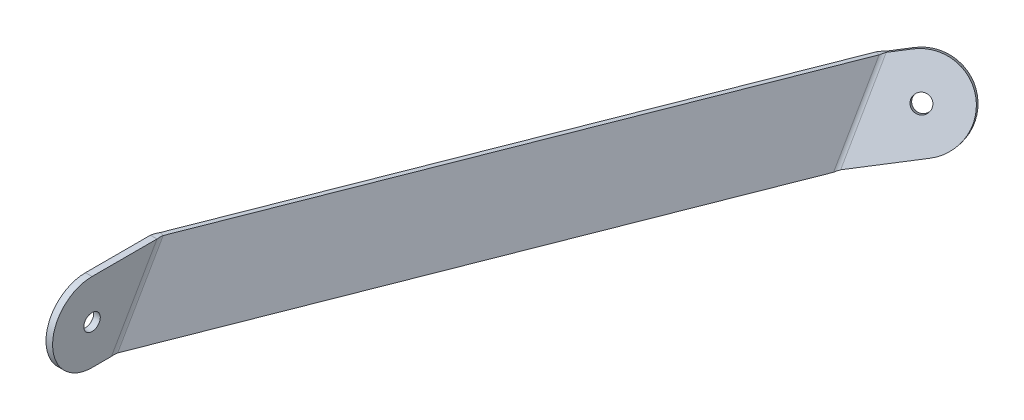
ISO-10303-21;
HEADER;
FILE_DESCRIPTION(('STEP AP214'),'2;1');
FILE_NAME('part.step','',(''),(''),'','','');
FILE_SCHEMA(('AUTOMOTIVE_DESIGN { 1 0 10303 214 1 1 1 1 }'));
ENDSEC;
DATA;
#1=APPLICATION_CONTEXT('core data for automotive mechanical design processes');
#2=APPLICATION_PROTOCOL_DEFINITION('international standard','automotive_design',2000,#1);
#3=PRODUCT_CONTEXT('',#1,'mechanical');
#4=PRODUCT('Part','Part','',(#3));
#5=PRODUCT_RELATED_PRODUCT_CATEGORY('part','',(#4));
#6=PRODUCT_DEFINITION_FORMATION('','',#4);
#7=PRODUCT_DEFINITION_CONTEXT('part definition',#1,'design');
#8=PRODUCT_DEFINITION('design','',#6,#7);
#9=PRODUCT_DEFINITION_SHAPE('','',#8);
#10=(LENGTH_UNIT() NAMED_UNIT(*) SI_UNIT(.MILLI.,.METRE.));
#11=(NAMED_UNIT(*) PLANE_ANGLE_UNIT() SI_UNIT($,.RADIAN.));
#12=(NAMED_UNIT(*) SI_UNIT($,.STERADIAN.) SOLID_ANGLE_UNIT());
#13=UNCERTAINTY_MEASURE_WITH_UNIT(LENGTH_MEASURE(1.E-05),#10,'distance_accuracy_value','');
#14=(GEOMETRIC_REPRESENTATION_CONTEXT(3) GLOBAL_UNCERTAINTY_ASSIGNED_CONTEXT((#13)) GLOBAL_UNIT_ASSIGNED_CONTEXT((#10,
#11,#12)) REPRESENTATION_CONTEXT('',''));
#15=CARTESIAN_POINT('',(0.,0.,0.));
#16=DIRECTION('',(0.,0.,1.));
#17=DIRECTION('',(1.,0.,0.));
#18=AXIS2_PLACEMENT_3D('',#15,#16,#17);
#19=CARTESIAN_POINT('',(-12.4707185432573,-1.70395305185188,-2.95133325951954));
#20=DIRECTION('',(0.866025403784438,0.249999999999999,0.433012701892221));
#21=DIRECTION('',(0.433012701892221,0.0580127018922194,-0.899519052838328));
#22=AXIS2_PLACEMENT_3D('',#19,#20,#21);
#23=PLANE('',#22);
#24=DIRECTION('',(0.433012701892221,0.0580127018922194,-0.899519052838328));
#25=VECTOR('',#24,1.);
#26=CARTESIAN_POINT('',(-17.2332185432573,16.7079929336715,-4.0564752305663));
#27=LINE('',#26,#25);
#28=CARTESIAN_POINT('',(-2.2391874454343,18.7168121956459,-35.2043297678663));
#29=VERTEX_POINT('',#28);
#30=CARTESIAN_POINT('',(110.049918479633,33.7606998213632,-268.468134188366));
#31=VERTEX_POINT('',#30);
#32=EDGE_CURVE('E525',#29,#31,#27,.T.);
#33=ORIENTED_EDGE('',*,*,#32,.T.);
#34=DIRECTION('',(0.,-0.86602540378444,0.499999999999997));
#35=VECTOR('',#34,1.);
#36=CARTESIAN_POINT('',(110.049918479633,-107.809937201526,-186.732288793855));
#37=LINE('',#36,#35);
#38=CARTESIAN_POINT('',(110.049918479633,-4.33930017863679,-246.471088932242));
#39=VERTEX_POINT('',#38);
#40=EDGE_CURVE('E548',#31,#39,#37,.T.);
#41=ORIENTED_EDGE('',*,*,#40,.T.);
#42=DIRECTION('',(0.433012701892221,0.0580127018922194,-0.899519052838328));
#43=VECTOR('',#42,1.);
#44=CARTESIAN_POINT('',(-7.70821854325729,-20.1158990373753,-1.84619128847274));
#45=LINE('',#44,#43);
#46=CARTESIAN_POINT('',(-2.2391874454343,-19.3831878043541,-13.2072845117417));
#47=VERTEX_POINT('',#46);
#48=EDGE_CURVE('E521',#47,#39,#45,.T.);
#49=ORIENTED_EDGE('',*,*,#48,.F.);
#50=DIRECTION('',(0.,-0.86602540378444,0.499999999999998));
#51=VECTOR('',#50,1.);
#52=CARTESIAN_POINT('',(-2.2391874454343,-10.564718902177,-18.298629906254));
#53=LINE('',#52,#51);
#54=EDGE_CURVE('E524',#29,#47,#53,.T.);
#55=ORIENTED_EDGE('',*,*,#54,.F.);
#56=EDGE_LOOP('',(#33,#41,#49,#55));
#57=FACE_BOUND('',#56,.T.);
#58=ADVANCED_FACE('F70',(#57),#23,.F.);
#59=CARTESIAN_POINT('',(-7.70821854325729,-20.1158990373753,-1.84619128847274));
#60=DIRECTION('',(0.249999999999999,-0.96650635094611,0.0580127018922194));
#61=DIRECTION('',(0.433012701892221,0.0580127018922194,-0.899519052838328));
#62=AXIS2_PLACEMENT_3D('',#59,#60,#61);
#63=PLANE('',#62);
#64=CARTESIAN_POINT('',(112.799549136649,-3.54555017863678,-245.096273603734));
#65=CARTESIAN_POINT('',(110.049918479633,-4.33930017863679,-246.471088932242));
#66=B_SPLINE_CURVE_WITH_KNOTS('',1,(#64,#65),.UNSPECIFIED.,.F.,.F.,(2,2),(0.,1.),.UNSPECIFIED.);
#67=CARTESIAN_POINT('',(112.799549136649,-3.54555017863683,-245.096273603734));
#68=VERTEX_POINT('',#67);
#69=EDGE_CURVE('E12',#68,#39,#66,.T.);
#70=ORIENTED_EDGE('',*,*,#69,.F.);
#71=DIRECTION('',(0.433012701892221,0.0580127018922194,-0.899519052838328));
#72=VECTOR('',#71,1.);
#73=CARTESIAN_POINT('',(-4.95858788624169,-19.3221490373753,-0.471375959964959));
#74=LINE('',#73,#72);
#75=CARTESIAN_POINT('',(0.51044321158129,-18.5894378043541,-11.8324691832339));
#76=VERTEX_POINT('',#75);
#77=EDGE_CURVE('E89',#76,#68,#74,.T.);
#78=ORIENTED_EDGE('',*,*,#77,.F.);
#79=CARTESIAN_POINT('',(-2.2391874454343,-19.3831878043541,-13.2072845117417));
#80=CARTESIAN_POINT('',(0.510443211581292,-18.5894378043541,-11.8324691832339));
#81=B_SPLINE_CURVE_WITH_KNOTS('',1,(#79,#80),.UNSPECIFIED.,.F.,.F.,(2,2),(0.,1.),.UNSPECIFIED.);
#82=EDGE_CURVE('E542',#76,#47,#81,.F.);
#83=ORIENTED_EDGE('',*,*,#82,.T.);
#84=ORIENTED_EDGE('',*,*,#48,.T.);
#85=EDGE_LOOP('',(#70,#78,#83,#84));
#86=FACE_BOUND('',#85,.T.);
#87=ADVANCED_FACE('F72',(#86),#63,.T.);
#88=CARTESIAN_POINT('',(-17.2332185432573,16.7079929336715,-4.0564752305663));
#89=DIRECTION('',(0.249999999999999,-0.96650635094611,0.0580127018922194));
#90=DIRECTION('',(0.433012701892221,0.0580127018922194,-0.899519052838328));
#91=AXIS2_PLACEMENT_3D('',#88,#89,#90);
#92=PLANE('',#91);
#93=CARTESIAN_POINT('',(110.049918479633,33.7606998213632,-268.468134188366));
#94=CARTESIAN_POINT('',(112.799549136649,34.5544498213632,-267.093318859859));
#95=B_SPLINE_CURVE_WITH_KNOTS('',1,(#93,#94),.UNSPECIFIED.,.F.,.F.,(2,2),(0.,1.),.UNSPECIFIED.);
#96=CARTESIAN_POINT('',(112.799549136649,34.5544498213632,-267.093318859859));
#97=VERTEX_POINT('',#96);
#98=EDGE_CURVE('E305',#31,#97,#95,.T.);
#99=ORIENTED_EDGE('',*,*,#98,.F.);
#100=ORIENTED_EDGE('',*,*,#32,.F.);
#101=CARTESIAN_POINT('',(0.510443211581286,19.5105621956459,-33.8295144393585));
#102=CARTESIAN_POINT('',(-2.23918744543431,18.7168121956459,-35.2043297678663));
#103=B_SPLINE_CURVE_WITH_KNOTS('',1,(#101,#102),.UNSPECIFIED.,.F.,.F.,(2,2),(0.,1.),.UNSPECIFIED.);
#104=CARTESIAN_POINT('',(0.510443211581286,19.5105621956459,-33.8295144393585));
#105=VERTEX_POINT('',#104);
#106=EDGE_CURVE('E669',#29,#105,#103,.F.);
#107=ORIENTED_EDGE('',*,*,#106,.T.);
#108=DIRECTION('',(0.433012701892221,0.0580127018922194,-0.899519052838328));
#109=VECTOR('',#108,1.);
#110=CARTESIAN_POINT('',(-14.4835878862417,17.5017429336715,-2.68165990205852));
#111=LINE('',#110,#109);
#112=EDGE_CURVE('E97',#105,#97,#111,.T.);
#113=ORIENTED_EDGE('',*,*,#112,.T.);
#114=EDGE_LOOP('',(#99,#100,#107,#113));
#115=FACE_BOUND('',#114,.T.);
#116=ADVANCED_FACE('F607',(#115),#92,.F.);
#117=CARTESIAN_POINT('',(-9.72108788624168,-0.910203051851881,-1.57651793101174));
#118=DIRECTION('',(0.866025403784438,0.249999999999999,0.433012701892221));
#119=DIRECTION('',(0.433012701892221,0.0580127018922194,-0.899519052838328));
#120=AXIS2_PLACEMENT_3D('',#117,#118,#119);
#121=PLANE('',#120);
#122=DIRECTION('',(0.,-0.86602540378444,0.499999999999997));
#123=VECTOR('',#122,1.);
#124=CARTESIAN_POINT('',(112.799549136649,-107.016187201526,-185.357473465347));
#125=LINE('',#124,#123);
#126=EDGE_CURVE('E82',#97,#68,#125,.T.);
#127=ORIENTED_EDGE('',*,*,#126,.F.);
#128=ORIENTED_EDGE('',*,*,#112,.F.);
#129=DIRECTION('',(0.,-0.86602540378444,0.499999999999998));
#130=VECTOR('',#129,1.);
#131=CARTESIAN_POINT('',(0.51044321158129,-9.77096890217699,-16.9238145777462));
#132=LINE('',#131,#130);
#133=EDGE_CURVE('E545',#105,#76,#132,.T.);
#134=ORIENTED_EDGE('',*,*,#133,.T.);
#135=ORIENTED_EDGE('',*,*,#77,.T.);
#136=EDGE_LOOP('',(#127,#128,#134,#135));
#137=FACE_BOUND('',#136,.T.);
#138=ADVANCED_FACE('F611',(#137),#121,.T.);
#139=CARTESIAN_POINT('',(-3.175,0.,0.));
#140=DIRECTION('',(1.,0.,0.));
#141=DIRECTION('',(0.,0.,-1.));
#142=AXIS2_PLACEMENT_3D('',#139,#140,#141);
#143=CYLINDRICAL_SURFACE('',#142,19.05);
#144=DIRECTION('',(-1.,0.,0.));
#145=VECTOR('',#144,1.);
#146=CARTESIAN_POINT('',(-3.175,-19.05,0.));
#147=LINE('',#146,#145);
#148=CARTESIAN_POINT('',(0.,-19.05,0.));
#149=VERTEX_POINT('',#148);
#150=CARTESIAN_POINT('',(-3.175,-19.05,0.));
#151=VERTEX_POINT('',#150);
#152=EDGE_CURVE('E459',#149,#151,#147,.T.);
#153=ORIENTED_EDGE('',*,*,#152,.F.);
#154=CARTESIAN_POINT('',(0.,0.,0.));
#155=DIRECTION('',(1.,0.,0.));
#156=DIRECTION('',(0.,0.,-1.));
#157=AXIS2_PLACEMENT_3D('',#154,#155,#156);
#158=CIRCLE('',#157,19.05);
#159=CARTESIAN_POINT('',(0.,19.05,0.));
#160=VERTEX_POINT('',#159);
#161=EDGE_CURVE('E455',#160,#149,#158,.T.);
#162=ORIENTED_EDGE('',*,*,#161,.F.);
#163=DIRECTION('',(-1.,0.,0.));
#164=VECTOR('',#163,1.);
#165=CARTESIAN_POINT('',(-3.175,19.05,0.));
#166=LINE('',#165,#164);
#167=CARTESIAN_POINT('',(-3.175,19.05,0.));
#168=VERTEX_POINT('',#167);
#169=EDGE_CURVE('E469',#160,#168,#166,.T.);
#170=ORIENTED_EDGE('',*,*,#169,.T.);
#171=CARTESIAN_POINT('',(-3.175,0.,0.));
#172=DIRECTION('',(1.,0.,0.));
#173=DIRECTION('',(0.,0.,-1.));
#174=AXIS2_PLACEMENT_3D('',#171,#172,#173);
#175=CIRCLE('',#174,19.05);
#176=EDGE_CURVE('E466',#168,#151,#175,.T.);
#177=ORIENTED_EDGE('',*,*,#176,.T.);
#178=EDGE_LOOP('',(#153,#162,#170,#177));
#179=FACE_BOUND('',#178,.T.);
#180=ADVANCED_FACE('F402',(#179),#143,.T.);
#181=CARTESIAN_POINT('',(-3.175,0.,0.));
#182=DIRECTION('',(1.,0.,0.));
#183=DIRECTION('',(0.,0.,-1.));
#184=AXIS2_PLACEMENT_3D('',#181,#182,#183);
#185=CYLINDRICAL_SURFACE('',#184,3.96874999999999);
#186=CARTESIAN_POINT('',(-3.175,0.,0.));
#187=DIRECTION('',(-1.,0.,0.));
#188=DIRECTION('',(0.,0.,1.));
#189=AXIS2_PLACEMENT_3D('',#186,#187,#188);
#190=CIRCLE('',#189,3.96874999999999);
#191=CARTESIAN_POINT('',(-3.175,0.,3.96874999999999));
#192=VERTEX_POINT('',#191);
#193=EDGE_CURVE('E462',#192,#192,#190,.T.);
#194=ORIENTED_EDGE('',*,*,#193,.T.);
#195=EDGE_LOOP('',(#194));
#196=FACE_BOUND('',#195,.T.);
#197=CARTESIAN_POINT('',(0.,0.,0.));
#198=DIRECTION('',(-1.,0.,0.));
#199=DIRECTION('',(0.,0.,1.));
#200=AXIS2_PLACEMENT_3D('',#197,#198,#199);
#201=CIRCLE('',#200,3.96874999999999);
#202=CARTESIAN_POINT('',(0.,0.,3.96874999999999));
#203=VERTEX_POINT('',#202);
#204=EDGE_CURVE('E445',#203,#203,#201,.T.);
#205=ORIENTED_EDGE('',*,*,#204,.F.);
#206=EDGE_LOOP('',(#205));
#207=FACE_BOUND('',#206,.T.);
#208=ADVANCED_FACE('F690',(#196,#207),#185,.F.);
#209=CARTESIAN_POINT('',(-3.175,0.,0.));
#210=DIRECTION('',(1.,0.,0.));
#211=DIRECTION('',(0.,0.,-1.));
#212=AXIS2_PLACEMENT_3D('',#209,#210,#211);
#213=PLANE('',#212);
#214=ORIENTED_EDGE('',*,*,#193,.F.);
#215=EDGE_LOOP('',(#214));
#216=FACE_BOUND('',#215,.T.);
#217=DIRECTION('',(0.,0.,-1.));
#218=VECTOR('',#217,1.);
#219=CARTESIAN_POINT('',(-3.175,19.05,0.));
#220=LINE('',#219,#218);
#221=CARTESIAN_POINT('',(-3.175,19.05,-31.3639042061113));
#222=VERTEX_POINT('',#221);
#223=EDGE_CURVE('E465',#168,#222,#220,.T.);
#224=ORIENTED_EDGE('',*,*,#223,.T.);
#225=DIRECTION('',(0.,-0.86602540378444,0.499999999999998));
#226=VECTOR('',#225,1.);
#227=CARTESIAN_POINT('',(-3.175,-8.81846890217699,-15.2740361835368));
#228=LINE('',#227,#226);
#229=CARTESIAN_POINT('',(-3.175,-19.05,-9.36685894998671));
#230=VERTEX_POINT('',#229);
#231=EDGE_CURVE('E461',#222,#230,#228,.T.);
#232=ORIENTED_EDGE('',*,*,#231,.T.);
#233=DIRECTION('',(0.,0.,-1.));
#234=VECTOR('',#233,1.);
#235=CARTESIAN_POINT('',(-3.175,-19.05,0.));
#236=LINE('',#235,#234);
#237=EDGE_CURVE('E458',#151,#230,#236,.T.);
#238=ORIENTED_EDGE('',*,*,#237,.F.);
#239=ORIENTED_EDGE('',*,*,#176,.F.);
#240=EDGE_LOOP('',(#224,#232,#238,#239));
#241=FACE_BOUND('',#240,.T.);
#242=ADVANCED_FACE('F498',(#216,#241),#213,.F.);
#243=CARTESIAN_POINT('',(-3.175,-19.05,0.));
#244=DIRECTION('',(0.,-1.,0.));
#245=DIRECTION('',(0.,0.,-1.));
#246=AXIS2_PLACEMENT_3D('',#243,#244,#245);
#247=PLANE('',#246);
#248=CARTESIAN_POINT('',(0.,-19.05,-9.36685894998671));
#249=CARTESIAN_POINT('',(-3.175,-19.05,-9.36685894998671));
#250=B_SPLINE_CURVE_WITH_KNOTS('',1,(#248,#249),.UNSPECIFIED.,.F.,.F.,(2,2),(0.,1.),.UNSPECIFIED.);
#251=CARTESIAN_POINT('',(0.,-19.05,-9.36685894998669));
#252=VERTEX_POINT('',#251);
#253=EDGE_CURVE('E441',#252,#230,#250,.T.);
#254=ORIENTED_EDGE('',*,*,#253,.F.);
#255=DIRECTION('',(0.,0.,-1.));
#256=VECTOR('',#255,1.);
#257=CARTESIAN_POINT('',(0.,-19.05,0.));
#258=LINE('',#257,#256);
#259=EDGE_CURVE('E454',#149,#252,#258,.T.);
#260=ORIENTED_EDGE('',*,*,#259,.F.);
#261=ORIENTED_EDGE('',*,*,#152,.T.);
#262=ORIENTED_EDGE('',*,*,#237,.T.);
#263=EDGE_LOOP('',(#254,#260,#261,#262));
#264=FACE_BOUND('',#263,.T.);
#265=ADVANCED_FACE('F487',(#264),#247,.T.);
#266=CARTESIAN_POINT('',(0.,0.,0.));
#267=DIRECTION('',(1.,0.,0.));
#268=DIRECTION('',(0.,0.,-1.));
#269=AXIS2_PLACEMENT_3D('',#266,#267,#268);
#270=PLANE('',#269);
#271=DIRECTION('',(0.,-0.86602540378444,0.499999999999998));
#272=VECTOR('',#271,1.);
#273=CARTESIAN_POINT('',(0.,-8.81846890217699,-15.2740361835368));
#274=LINE('',#273,#272);
#275=CARTESIAN_POINT('',(0.,19.05,-31.3639042061113));
#276=VERTEX_POINT('',#275);
#277=EDGE_CURVE('E485',#276,#252,#274,.T.);
#278=ORIENTED_EDGE('',*,*,#277,.F.);
#279=DIRECTION('',(0.,0.,-1.));
#280=VECTOR('',#279,1.);
#281=CARTESIAN_POINT('',(0.,19.05,0.));
#282=LINE('',#281,#280);
#283=EDGE_CURVE('E453',#160,#276,#282,.T.);
#284=ORIENTED_EDGE('',*,*,#283,.F.);
#285=ORIENTED_EDGE('',*,*,#161,.T.);
#286=ORIENTED_EDGE('',*,*,#259,.T.);
#287=EDGE_LOOP('',(#278,#284,#285,#286));
#288=FACE_BOUND('',#287,.T.);
#289=ORIENTED_EDGE('',*,*,#204,.T.);
#290=EDGE_LOOP('',(#289));
#291=FACE_BOUND('',#290,.T.);
#292=ADVANCED_FACE('F497',(#288,#291),#270,.T.);
#293=CARTESIAN_POINT('',(-3.175,19.05,0.));
#294=DIRECTION('',(0.,-1.,0.));
#295=DIRECTION('',(0.,0.,-1.));
#296=AXIS2_PLACEMENT_3D('',#293,#294,#295);
#297=PLANE('',#296);
#298=CARTESIAN_POINT('',(-3.175,19.05,-31.3639042061113));
#299=CARTESIAN_POINT('',(0.,19.05,-31.3639042061113));
#300=B_SPLINE_CURVE_WITH_KNOTS('',1,(#298,#299),.UNSPECIFIED.,.F.,.F.,(2,2),(0.,1.),.UNSPECIFIED.);
#301=EDGE_CURVE('E428',#222,#276,#300,.T.);
#302=ORIENTED_EDGE('',*,*,#301,.F.);
#303=ORIENTED_EDGE('',*,*,#223,.F.);
#304=ORIENTED_EDGE('',*,*,#169,.F.);
#305=ORIENTED_EDGE('',*,*,#283,.T.);
#306=EDGE_LOOP('',(#302,#303,#304,#305));
#307=FACE_BOUND('',#306,.T.);
#308=ADVANCED_FACE('F401',(#307),#297,.F.);
#309=CARTESIAN_POINT('',(-3.175,19.05,-31.3639042061113));
#310=CARTESIAN_POINT('',(-3.175,18.9112680631787,-32.6935130958568));
#311=CARTESIAN_POINT('',(-2.84960796744825,18.7737632895088,-34.0163694532108));
#312=CARTESIAN_POINT('',(-2.23918744543431,18.7168121956459,-35.2043297678663));
#313=CARTESIAN_POINT('',(0.,19.05,-31.3639042061113));
#314=CARTESIAN_POINT('',(0.,19.1886874107079,-32.2126590735088));
#315=CARTESIAN_POINT('',(0.17759342588229,19.3272813692986,-33.0579976335316));
#316=CARTESIAN_POINT('',(0.510443211581286,19.5105621956459,-33.8295144393585));
#317=B_SPLINE_SURFACE_WITH_KNOTS('',1,3,((#309,#310,#311,#312),(#313,#314,#315,#316)),
.UNSPECIFIED.,.F.,.F.,.F.,(2,2),(4,4),(0.,1.),(0.,1.),.UNSPECIFIED.);
#318=CARTESIAN_POINT('',(0.,19.05,-31.3639042061113));
#319=CARTESIAN_POINT('',(0.,19.1886874107079,-32.2126590735088));
#320=CARTESIAN_POINT('',(0.17759342588229,19.3272813692986,-33.0579976335316));
#321=CARTESIAN_POINT('',(0.510443211581286,19.5105621956459,-33.8295144393585));
#322=B_SPLINE_CURVE_WITH_KNOTS('',3,(#318,#319,#320,#321),.UNSPECIFIED.,.F.,.F.,(4,4),(0.,1.),.UNSPECIFIED.);
#323=EDGE_CURVE('E554',#276,#105,#322,.T.);
#324=CARTESIAN_POINT('',(-2.23918744543431,18.7168121956459,-35.2043297678663));
#325=CARTESIAN_POINT('',(-2.84960796744825,18.7737632895088,-34.0163694532108));
#326=CARTESIAN_POINT('',(-3.175,18.9112680631787,-32.6935130958568));
#327=CARTESIAN_POINT('',(-3.175,19.05,-31.3639042061113));
#328=B_SPLINE_CURVE_WITH_KNOTS('',3,(#324,#325,#326,#327),.UNSPECIFIED.,.F.,.F.,(4,4),(0.,1.),.UNSPECIFIED.);
#329=EDGE_CURVE('E384',#222,#29,#328,.F.);
#330=ORIENTED_EDGE('',*,*,#301,.T.);
#331=ORIENTED_EDGE('',*,*,#323,.T.);
#332=ORIENTED_EDGE('',*,*,#106,.F.);
#333=ORIENTED_EDGE('',*,*,#329,.F.);
#334=EDGE_LOOP('',(#330,#331,#332,#333));
#335=FACE_BOUND('',#334,.T.);
#336=ADVANCED_FACE('F390',(#335),#317,.T.);
#337=CARTESIAN_POINT('',(-2.2391874454343,-19.3831878043541,-13.2072845117417));
#338=CARTESIAN_POINT('',(-2.84960796744823,-19.3262367104912,-12.0193241970862));
#339=CARTESIAN_POINT('',(-3.175,-19.1887319368213,-10.6964678397322));
#340=CARTESIAN_POINT('',(-3.175,-19.05,-9.36685894998671));
#341=CARTESIAN_POINT('',(0.510443211581292,-18.5894378043541,-11.8324691832339));
#342=CARTESIAN_POINT('',(0.177593425882298,-18.7727186307014,-11.060952377407));
#343=CARTESIAN_POINT('',(0.,-18.9113125892921,-10.2156138173842));
#344=CARTESIAN_POINT('',(0.,-19.05,-9.36685894998671));
#345=B_SPLINE_SURFACE_WITH_KNOTS('',1,3,((#337,#338,#339,#340),(#341,#342,#343,#344)),
.UNSPECIFIED.,.F.,.F.,.F.,(2,2),(4,4),(0.,1.),(0.,1.),.UNSPECIFIED.);
#346=CARTESIAN_POINT('',(0.510443211581292,-18.5894378043541,-11.8324691832339));
#347=CARTESIAN_POINT('',(0.177593425882298,-18.7727186307014,-11.060952377407));
#348=CARTESIAN_POINT('',(0.,-18.9113125892921,-10.2156138173842));
#349=CARTESIAN_POINT('',(0.,-19.05,-9.36685894998671));
#350=B_SPLINE_CURVE_WITH_KNOTS('',3,(#346,#347,#348,#349),.UNSPECIFIED.,.F.,.F.,(4,4),(0.,1.),.UNSPECIFIED.);
#351=EDGE_CURVE('E347',#76,#252,#350,.T.);
#352=CARTESIAN_POINT('',(-3.175,-19.05,-9.36685894998671));
#353=CARTESIAN_POINT('',(-3.175,-19.1887319368213,-10.6964678397322));
#354=CARTESIAN_POINT('',(-2.84960796744823,-19.3262367104912,-12.0193241970862));
#355=CARTESIAN_POINT('',(-2.2391874454343,-19.3831878043541,-13.2072845117417));
#356=B_SPLINE_CURVE_WITH_KNOTS('',3,(#352,#353,#354,#355),.UNSPECIFIED.,.F.,.F.,(4,4),(0.,1.),.UNSPECIFIED.);
#357=EDGE_CURVE('E340',#47,#230,#356,.F.);
#358=ORIENTED_EDGE('',*,*,#82,.F.);
#359=ORIENTED_EDGE('',*,*,#351,.T.);
#360=ORIENTED_EDGE('',*,*,#253,.T.);
#361=ORIENTED_EDGE('',*,*,#357,.F.);
#362=EDGE_LOOP('',(#358,#359,#360,#361));
#363=FACE_BOUND('',#362,.T.);
#364=ADVANCED_FACE('F360',(#363),#345,.T.);
#365=CARTESIAN_POINT('',(3.81,39.6841629259491,-43.2770437259105));
#366=DIRECTION('',(0.,-0.86602540378444,0.499999999999998));
#367=DIRECTION('',(0.,-0.499999999999998,-0.86602540378444));
#368=AXIS2_PLACEMENT_3D('',#365,#366,#367);
#369=CYLINDRICAL_SURFACE('',#368,6.985);
#370=ORIENTED_EDGE('',*,*,#357,.T.);
#371=ORIENTED_EDGE('',*,*,#231,.F.);
#372=ORIENTED_EDGE('',*,*,#329,.T.);
#373=ORIENTED_EDGE('',*,*,#54,.T.);
#374=EDGE_LOOP('',(#370,#371,#372,#373));
#375=FACE_BOUND('',#374,.T.);
#376=ADVANCED_FACE('F279',(#375),#369,.T.);
#377=CARTESIAN_POINT('',(3.81,39.6841629259491,-43.2770437259105));
#378=DIRECTION('',(0.,-0.86602540378444,0.499999999999998));
#379=DIRECTION('',(0.,-0.499999999999998,-0.86602540378444));
#380=AXIS2_PLACEMENT_3D('',#377,#378,#379);
#381=CYLINDRICAL_SURFACE('',#380,3.81);
#382=ORIENTED_EDGE('',*,*,#351,.F.);
#383=ORIENTED_EDGE('',*,*,#133,.F.);
#384=ORIENTED_EDGE('',*,*,#323,.F.);
#385=ORIENTED_EDGE('',*,*,#277,.T.);
#386=EDGE_LOOP('',(#382,#383,#384,#385));
#387=FACE_BOUND('',#386,.T.);
#388=ADVANCED_FACE('F275',(#387),#381,.F.);
#389=CARTESIAN_POINT('',(110.049918479633,33.7606998213632,-268.468134188366));
#390=CARTESIAN_POINT('',(110.660339001647,33.7037487275004,-269.656094503022));
#391=CARTESIAN_POINT('',(111.549326566957,33.7289399701064,-270.697153093997));
#392=CARTESIAN_POINT('',(112.606605925067,33.895418294292,-271.498122304687));
#393=CARTESIAN_POINT('',(112.799549136649,34.5544498213632,-267.093318859859));
#394=CARTESIAN_POINT('',(113.132398922348,34.7377306477105,-267.864835665685));
#395=CARTESIAN_POINT('',(113.617593184949,34.9651213192425,-268.556373807349));
#396=CARTESIAN_POINT('',(114.194105925067,35.2702336227998,-269.116872304687));
#397=B_SPLINE_SURFACE_WITH_KNOTS('',1,3,((#389,#390,#391,#392),(#393,#394,#395,#396)),
.UNSPECIFIED.,.F.,.F.,.F.,(2,2),(4,4),(0.,1.),(0.,1.),.UNSPECIFIED.);
#398=CARTESIAN_POINT('',(112.799549136649,34.5544498213632,-267.093318859859));
#399=CARTESIAN_POINT('',(113.132398922348,34.7377306477105,-267.864835665685));
#400=CARTESIAN_POINT('',(113.617593184949,34.9651213192425,-268.556373807349));
#401=CARTESIAN_POINT('',(114.194105925067,35.2702336227998,-269.116872304687));
#402=B_SPLINE_CURVE_WITH_KNOTS('',3,(#398,#399,#400,#401),.UNSPECIFIED.,.F.,.F.,(4,4),(0.,1.),.UNSPECIFIED.);
#403=CARTESIAN_POINT('',(114.194105925067,35.2702336227997,-269.116872304687));
#404=VERTEX_POINT('',#403);
#405=EDGE_CURVE('E174',#97,#404,#402,.T.);
#406=CARTESIAN_POINT('',(114.194105925067,35.2702336227998,-269.116872304687));
#407=CARTESIAN_POINT('',(112.606605925067,33.895418294292,-271.498122304687));
#408=B_SPLINE_CURVE_WITH_KNOTS('',1,(#406,#407),.UNSPECIFIED.,.F.,.F.,(2,2),(0.,1.),.UNSPECIFIED.);
#409=CARTESIAN_POINT('',(112.606605925067,33.8954182942919,-271.498122304687));
#410=VERTEX_POINT('',#409);
#411=EDGE_CURVE('E191',#410,#404,#408,.F.);
#412=CARTESIAN_POINT('',(112.606605925067,33.895418294292,-271.498122304687));
#413=CARTESIAN_POINT('',(111.549326566957,33.7289399701064,-270.697153093997));
#414=CARTESIAN_POINT('',(110.660339001647,33.7037487275004,-269.656094503022));
#415=CARTESIAN_POINT('',(110.049918479633,33.7606998213632,-268.468134188366));
#416=B_SPLINE_CURVE_WITH_KNOTS('',3,(#412,#413,#414,#415),.UNSPECIFIED.,.F.,.F.,(4,4),(0.,1.),.UNSPECIFIED.);
#417=EDGE_CURVE('E240',#31,#410,#416,.F.);
#418=ORIENTED_EDGE('',*,*,#98,.T.);
#419=ORIENTED_EDGE('',*,*,#405,.T.);
#420=ORIENTED_EDGE('',*,*,#411,.F.);
#421=ORIENTED_EDGE('',*,*,#417,.F.);
#422=EDGE_LOOP('',(#418,#419,#420,#421));
#423=FACE_BOUND('',#422,.T.);
#424=ADVANCED_FACE('F264',(#423),#397,.T.);
#425=CARTESIAN_POINT('',(112.606605925067,-4.20458170570804,-249.501077048563));
#426=CARTESIAN_POINT('',(111.549326566957,-4.37106002989363,-248.700107837873));
#427=CARTESIAN_POINT('',(110.660339001647,-4.39625127249963,-247.659049246897));
#428=CARTESIAN_POINT('',(110.049918479633,-4.33930017863679,-246.471088932242));
#429=CARTESIAN_POINT('',(114.194105925067,-2.82976637720024,-247.119827048563));
#430=CARTESIAN_POINT('',(113.617593184948,-3.13487868075772,-246.559328551224));
#431=CARTESIAN_POINT('',(113.132398922348,-3.36226935228937,-245.867790409561));
#432=CARTESIAN_POINT('',(112.799549136649,-3.54555017863678,-245.096273603734));
#433=B_SPLINE_SURFACE_WITH_KNOTS('',1,3,((#425,#426,#427,#428),(#429,#430,#431,#432)),
.UNSPECIFIED.,.F.,.F.,.F.,(2,2),(4,4),(0.,1.),(0.,1.),.UNSPECIFIED.);
#434=CARTESIAN_POINT('',(112.606605925067,-4.20458170570804,-249.501077048563));
#435=CARTESIAN_POINT('',(114.194105925067,-2.82976637720024,-247.119827048563));
#436=B_SPLINE_CURVE_WITH_KNOTS('',1,(#434,#435),.UNSPECIFIED.,.F.,.F.,(2,2),(0.,1.),.UNSPECIFIED.);
#437=CARTESIAN_POINT('',(114.194105925067,-2.82976637720028,-247.119827048563));
#438=VERTEX_POINT('',#437);
#439=CARTESIAN_POINT('',(112.606605925067,-4.20458170570804,-249.501077048563));
#440=VERTEX_POINT('',#439);
#441=EDGE_CURVE('E170',#438,#440,#436,.F.);
#442=CARTESIAN_POINT('',(114.194105925067,-2.82976637720024,-247.119827048563));
#443=CARTESIAN_POINT('',(113.617593184948,-3.13487868075772,-246.559328551224));
#444=CARTESIAN_POINT('',(113.132398922348,-3.36226935228937,-245.867790409561));
#445=CARTESIAN_POINT('',(112.799549136649,-3.54555017863678,-245.096273603734));
#446=B_SPLINE_CURVE_WITH_KNOTS('',3,(#442,#443,#444,#445),.UNSPECIFIED.,.F.,.F.,(4,4),(0.,1.),.UNSPECIFIED.);
#447=EDGE_CURVE('E559',#438,#68,#446,.T.);
#448=CARTESIAN_POINT('',(110.049918479633,-4.33930017863679,-246.471088932242));
#449=CARTESIAN_POINT('',(110.660339001647,-4.39625127249963,-247.659049246897));
#450=CARTESIAN_POINT('',(111.549326566957,-4.37106002989363,-248.700107837873));
#451=CARTESIAN_POINT('',(112.606605925067,-4.20458170570804,-249.501077048563));
#452=B_SPLINE_CURVE_WITH_KNOTS('',3,(#448,#449,#450,#451),.UNSPECIFIED.,.F.,.F.,(4,4),(0.,1.),.UNSPECIFIED.);
#453=EDGE_CURVE('E556',#440,#39,#452,.F.);
#454=ORIENTED_EDGE('',*,*,#441,.F.);
#455=ORIENTED_EDGE('',*,*,#447,.T.);
#456=ORIENTED_EDGE('',*,*,#69,.T.);
#457=ORIENTED_EDGE('',*,*,#453,.F.);
#458=EDGE_LOOP('',(#454,#455,#456,#457));
#459=FACE_BOUND('',#458,.T.);
#460=ADVANCED_FACE('F216',(#459),#433,.T.);
#461=CARTESIAN_POINT('',(116.099105925067,57.4162639579163,-278.092888880148));
#462=DIRECTION('',(0.,-0.86602540378444,0.499999999999997));
#463=DIRECTION('',(0.,-0.499999999999997,-0.866025403784441));
#464=AXIS2_PLACEMENT_3D('',#461,#462,#463);
#465=CYLINDRICAL_SURFACE('',#464,6.985);
#466=ORIENTED_EDGE('',*,*,#453,.T.);
#467=ORIENTED_EDGE('',*,*,#40,.F.);
#468=ORIENTED_EDGE('',*,*,#417,.T.);
#469=DIRECTION('',(0.,-0.866025403784441,0.499999999999997));
#470=VECTOR('',#469,1.);
#471=CARTESIAN_POINT('',(112.606605925068,-109.088280924243,-188.946445071138));
#472=LINE('',#471,#470);
#473=EDGE_CURVE('E199',#410,#440,#472,.T.);
#474=ORIENTED_EDGE('',*,*,#473,.T.);
#475=EDGE_LOOP('',(#466,#467,#468,#474));
#476=FACE_BOUND('',#475,.T.);
#477=ADVANCED_FACE('F206',(#476),#465,.T.);
#478=CARTESIAN_POINT('',(116.099105925067,57.4162639579163,-278.092888880148));
#479=DIRECTION('',(0.,-0.86602540378444,0.499999999999997));
#480=DIRECTION('',(0.,-0.499999999999997,-0.866025403784441));
#481=AXIS2_PLACEMENT_3D('',#478,#479,#480);
#482=CYLINDRICAL_SURFACE('',#481,3.81);
#483=ORIENTED_EDGE('',*,*,#447,.F.);
#484=DIRECTION('',(0.,-0.866025403784441,0.499999999999997));
#485=VECTOR('',#484,1.);
#486=CARTESIAN_POINT('',(114.194105925068,-107.713465595735,-186.565195071138));
#487=LINE('',#486,#485);
#488=EDGE_CURVE('E576',#404,#438,#487,.T.);
#489=ORIENTED_EDGE('',*,*,#488,.F.);
#490=ORIENTED_EDGE('',*,*,#405,.F.);
#491=ORIENTED_EDGE('',*,*,#126,.T.);
#492=EDGE_LOOP('',(#483,#489,#490,#491));
#493=FACE_BOUND('',#492,.T.);
#494=ADVANCED_FACE('F215',(#493),#482,.F.);
#495=CARTESIAN_POINT('',(127.880642108604,19.2546527453804,-273.227963162905));
#496=DIRECTION('',(0.499999999999998,0.433012701892218,0.750000000000002));
#497=DIRECTION('',(0.750000000000002,0.21650635094611,-0.624999999999997));
#498=AXIS2_PLACEMENT_3D('',#495,#496,#497);
#499=CYLINDRICAL_SURFACE('',#498,3.96874999999999);
#500=CARTESIAN_POINT('',(127.880642108604,19.2546527453804,-273.227963162905));
#501=DIRECTION('',(-0.499999999999998,-0.433012701892218,-0.750000000000002));
#502=DIRECTION('',(-0.750000000000002,-0.21650635094611,0.624999999999997));
#503=AXIS2_PLACEMENT_3D('',#500,#501,#502);
#504=CIRCLE('',#503,3.96874999999999);
#505=CARTESIAN_POINT('',(124.904079608604,18.3953931650631,-270.747494412905));
#506=VERTEX_POINT('',#505);
#507=EDGE_CURVE('E183',#506,#506,#504,.T.);
#508=ORIENTED_EDGE('',*,*,#507,.T.);
#509=EDGE_LOOP('',(#508));
#510=FACE_BOUND('',#509,.T.);
#511=CARTESIAN_POINT('',(129.468142108604,20.6294680738882,-270.846713162905));
#512=DIRECTION('',(-0.499999999999998,-0.433012701892218,-0.750000000000002));
#513=DIRECTION('',(-0.750000000000002,-0.21650635094611,0.624999999999997));
#514=AXIS2_PLACEMENT_3D('',#511,#512,#513);
#515=CIRCLE('',#514,3.96874999999999);
#516=CARTESIAN_POINT('',(126.491579608604,19.7702084935709,-268.366244412905));
#517=VERTEX_POINT('',#516);
#518=EDGE_CURVE('E567',#517,#517,#515,.T.);
#519=ORIENTED_EDGE('',*,*,#518,.F.);
#520=EDGE_LOOP('',(#519));
#521=FACE_BOUND('',#520,.T.);
#522=ADVANCED_FACE('F820',(#510,#521),#499,.F.);
#523=CARTESIAN_POINT('',(127.880642108604,19.2546527453804,-273.227963162905));
#524=DIRECTION('',(0.499999999999998,0.433012701892218,0.750000000000002));
#525=DIRECTION('',(0.750000000000002,0.21650635094611,-0.624999999999997));
#526=AXIS2_PLACEMENT_3D('',#523,#524,#525);
#527=CYLINDRICAL_SURFACE('',#526,19.05);
#528=DIRECTION('',(-0.499999999999998,-0.433012701892218,-0.750000000000002));
#529=VECTOR('',#528,1.);
#530=CARTESIAN_POINT('',(119.631750137557,35.9234027453804,-277.352409148429));
#531=LINE('',#530,#529);
#532=CARTESIAN_POINT('',(121.219250137557,37.2982180738883,-274.971159148429));
#533=VERTEX_POINT('',#532);
#534=CARTESIAN_POINT('',(119.631750137557,35.9234027453804,-277.352409148429));
#535=VERTEX_POINT('',#534);
#536=EDGE_CURVE('E194',#533,#535,#531,.T.);
#537=ORIENTED_EDGE('',*,*,#536,.F.);
#538=CARTESIAN_POINT('',(129.468142108604,20.6294680738882,-270.846713162905));
#539=DIRECTION('',(0.499999999999998,0.433012701892218,0.750000000000002));
#540=DIRECTION('',(0.750000000000002,0.21650635094611,-0.624999999999997));
#541=AXIS2_PLACEMENT_3D('',#538,#539,#540);
#542=CIRCLE('',#541,19.05);
#543=CARTESIAN_POINT('',(137.717034079651,3.9607180738882,-266.722267177382));
#544=VERTEX_POINT('',#543);
#545=EDGE_CURVE('E182',#544,#533,#542,.T.);
#546=ORIENTED_EDGE('',*,*,#545,.F.);
#547=DIRECTION('',(-0.499999999999998,-0.433012701892218,-0.750000000000002));
#548=VECTOR('',#547,1.);
#549=CARTESIAN_POINT('',(136.129534079651,2.58590274538041,-269.103517177382));
#550=LINE('',#549,#548);
#551=CARTESIAN_POINT('',(136.129534079651,2.58590274538041,-269.103517177382));
#552=VERTEX_POINT('',#551);
#553=EDGE_CURVE('E167',#544,#552,#550,.T.);
#554=ORIENTED_EDGE('',*,*,#553,.T.);
#555=CARTESIAN_POINT('',(127.880642108604,19.2546527453804,-273.227963162905));
#556=DIRECTION('',(0.499999999999998,0.433012701892218,0.750000000000002));
#557=DIRECTION('',(0.750000000000002,0.21650635094611,-0.624999999999997));
#558=AXIS2_PLACEMENT_3D('',#555,#556,#557);
#559=CIRCLE('',#558,19.05);
#560=EDGE_CURVE('E180',#552,#535,#559,.T.);
#561=ORIENTED_EDGE('',*,*,#560,.T.);
#562=EDGE_LOOP('',(#537,#546,#554,#561));
#563=FACE_BOUND('',#562,.T.);
#564=ADVANCED_FACE('F179',(#563),#527,.T.);
#565=CARTESIAN_POINT('',(-102.052857891397,-47.121431314976,-81.6167131629063));
#566=DIRECTION('',(0.499999999999998,0.433012701892218,0.750000000000002));
#567=DIRECTION('',(0.750000000000002,0.21650635094611,-0.624999999999997));
#568=AXIS2_PLACEMENT_3D('',#565,#566,#567);
#569=PLANE('',#568);
#570=ORIENTED_EDGE('',*,*,#473,.F.);
#571=DIRECTION('',(0.750000000000002,0.21650635094611,-0.624999999999997));
#572=VECTOR('',#571,1.);
#573=CARTESIAN_POINT('',(-110.301749862443,-30.452681314976,-85.7411591484296));
#574=LINE('',#573,#572);
#575=EDGE_CURVE('E188',#410,#535,#574,.T.);
#576=ORIENTED_EDGE('',*,*,#575,.T.);
#577=ORIENTED_EDGE('',*,*,#560,.F.);
#578=DIRECTION('',(0.750000000000002,0.21650635094611,-0.624999999999997));
#579=VECTOR('',#578,1.);
#580=CARTESIAN_POINT('',(-93.8039659203499,-63.7901813149761,-77.4922671773829));
#581=LINE('',#580,#579);
#582=EDGE_CURVE('E164',#440,#552,#581,.T.);
#583=ORIENTED_EDGE('',*,*,#582,.F.);
#584=EDGE_LOOP('',(#570,#576,#577,#583));
#585=FACE_BOUND('',#584,.T.);
#586=ORIENTED_EDGE('',*,*,#507,.F.);
#587=EDGE_LOOP('',(#586));
#588=FACE_BOUND('',#587,.T.);
#589=ADVANCED_FACE('F185',(#585,#588),#569,.F.);
#590=CARTESIAN_POINT('',(-110.301749862443,-30.452681314976,-85.7411591484296));
#591=DIRECTION('',(0.433012701892218,-0.875000000000001,0.21650635094611));
#592=DIRECTION('',(0.750000000000002,0.21650635094611,-0.624999999999997));
#593=AXIS2_PLACEMENT_3D('',#590,#591,#592);
#594=PLANE('',#593);
#595=ORIENTED_EDGE('',*,*,#575,.F.);
#596=ORIENTED_EDGE('',*,*,#411,.T.);
#597=DIRECTION('',(0.750000000000002,0.21650635094611,-0.624999999999997));
#598=VECTOR('',#597,1.);
#599=CARTESIAN_POINT('',(-108.714249862443,-29.0778659864682,-83.3599091484297));
#600=LINE('',#599,#598);
#601=EDGE_CURVE('E565',#404,#533,#600,.T.);
#602=ORIENTED_EDGE('',*,*,#601,.T.);
#603=ORIENTED_EDGE('',*,*,#536,.T.);
#604=EDGE_LOOP('',(#595,#596,#602,#603));
#605=FACE_BOUND('',#604,.T.);
#606=ADVANCED_FACE('F587',(#605),#594,.F.);
#607=CARTESIAN_POINT('',(-100.465357891397,-45.7466159864683,-79.2354631629063));
#608=DIRECTION('',(0.499999999999998,0.433012701892218,0.750000000000002));
#609=DIRECTION('',(0.750000000000002,0.21650635094611,-0.624999999999997));
#610=AXIS2_PLACEMENT_3D('',#607,#608,#609);
#611=PLANE('',#610);
#612=ORIENTED_EDGE('',*,*,#518,.T.);
#613=EDGE_LOOP('',(#612));
#614=FACE_BOUND('',#613,.T.);
#615=ORIENTED_EDGE('',*,*,#601,.F.);
#616=ORIENTED_EDGE('',*,*,#488,.T.);
#617=DIRECTION('',(0.750000000000002,0.21650635094611,-0.624999999999997));
#618=VECTOR('',#617,1.);
#619=CARTESIAN_POINT('',(-92.2164659203499,-62.4153659864683,-75.1110171773829));
#620=LINE('',#619,#618);
#621=EDGE_CURVE('E574',#438,#544,#620,.T.);
#622=ORIENTED_EDGE('',*,*,#621,.T.);
#623=ORIENTED_EDGE('',*,*,#545,.T.);
#624=EDGE_LOOP('',(#615,#616,#622,#623));
#625=FACE_BOUND('',#624,.T.);
#626=ADVANCED_FACE('F596',(#614,#625),#611,.T.);
#627=CARTESIAN_POINT('',(-93.8039659203499,-63.7901813149761,-77.4922671773829));
#628=DIRECTION('',(0.433012701892218,-0.875000000000001,0.21650635094611));
#629=DIRECTION('',(0.750000000000002,0.21650635094611,-0.624999999999997));
#630=AXIS2_PLACEMENT_3D('',#627,#628,#629);
#631=PLANE('',#630);
#632=ORIENTED_EDGE('',*,*,#621,.F.);
#633=ORIENTED_EDGE('',*,*,#441,.T.);
#634=ORIENTED_EDGE('',*,*,#582,.T.);
#635=ORIENTED_EDGE('',*,*,#553,.F.);
#636=EDGE_LOOP('',(#632,#633,#634,#635));
#637=FACE_BOUND('',#636,.T.);
#638=ADVANCED_FACE('F166',(#637),#631,.T.);
#639=CLOSED_SHELL('',(#58,#87,#116,#138,#180,#208,#242,#265,#292,#308,#336,#364,#376,#388,#424,
#460,#477,#494,#522,#564,#589,#606,#626,#638));
#640=MANIFOLD_SOLID_BREP('B2',#639);
#641=ADVANCED_BREP_SHAPE_REPRESENTATION('',(#18,#640),#14);
#642=SHAPE_DEFINITION_REPRESENTATION(#9,#641);
ENDSEC;
END-ISO-10303-21;
